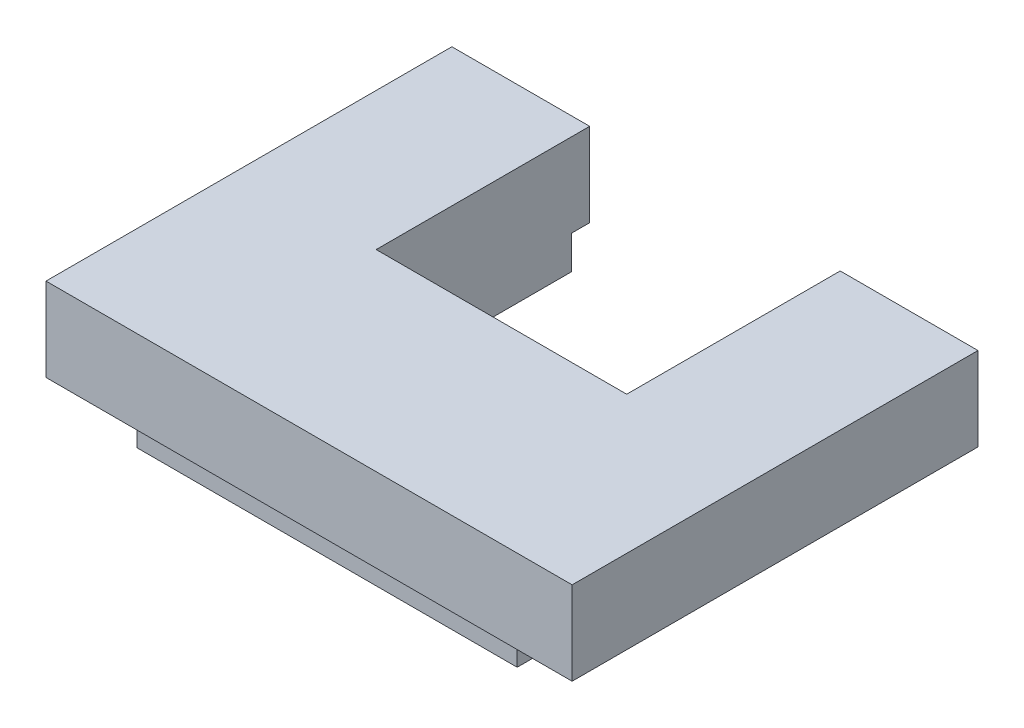
ISO-10303-21;
HEADER;
FILE_DESCRIPTION(('STEP AP214'),'2;1');
FILE_NAME('part.step','',(''),(''),'','','');
FILE_SCHEMA(('AUTOMOTIVE_DESIGN { 1 0 10303 214 1 1 1 1 }'));
ENDSEC;
DATA;
#1=APPLICATION_CONTEXT('core data for automotive mechanical design processes');
#2=APPLICATION_PROTOCOL_DEFINITION('international standard','automotive_design',2000,#1);
#3=PRODUCT_CONTEXT('',#1,'mechanical');
#4=PRODUCT('Part','Part','',(#3));
#5=PRODUCT_RELATED_PRODUCT_CATEGORY('part','',(#4));
#6=PRODUCT_DEFINITION_FORMATION('','',#4);
#7=PRODUCT_DEFINITION_CONTEXT('part definition',#1,'design');
#8=PRODUCT_DEFINITION('design','',#6,#7);
#9=PRODUCT_DEFINITION_SHAPE('','',#8);
#10=(LENGTH_UNIT() NAMED_UNIT(*) SI_UNIT(.MILLI.,.METRE.));
#11=(NAMED_UNIT(*) PLANE_ANGLE_UNIT() SI_UNIT($,.RADIAN.));
#12=(NAMED_UNIT(*) SI_UNIT($,.STERADIAN.) SOLID_ANGLE_UNIT());
#13=UNCERTAINTY_MEASURE_WITH_UNIT(LENGTH_MEASURE(1.E-05),#10,'distance_accuracy_value','');
#14=(GEOMETRIC_REPRESENTATION_CONTEXT(3) GLOBAL_UNCERTAINTY_ASSIGNED_CONTEXT((#13)) GLOBAL_UNIT_ASSIGNED_CONTEXT((#10,
#11,#12)) REPRESENTATION_CONTEXT('',''));
#15=CARTESIAN_POINT('',(0.,0.,0.));
#16=DIRECTION('',(0.,0.,1.));
#17=DIRECTION('',(1.,0.,0.));
#18=AXIS2_PLACEMENT_3D('',#15,#16,#17);
#19=CARTESIAN_POINT('',(-400.05,-304.8,-308.61));
#20=DIRECTION('',(0.,0.,-1.));
#21=DIRECTION('',(-1.,0.,0.));
#22=AXIS2_PLACEMENT_3D('',#19,#20,#21);
#23=PLANE('',#22);
#24=DIRECTION('',(0.,1.,0.));
#25=VECTOR('',#24,1.);
#26=CARTESIAN_POINT('',(-190.5,-177.8,-308.61));
#27=LINE('',#26,#25);
#28=CARTESIAN_POINT('',(-190.5,-127.,-308.61));
#29=VERTEX_POINT('',#28);
#30=CARTESIAN_POINT('',(-190.5,0.,-308.61));
#31=VERTEX_POINT('',#30);
#32=EDGE_CURVE('E244',#29,#31,#27,.T.);
#33=ORIENTED_EDGE('',*,*,#32,.F.);
#34=DIRECTION('',(-1.,0.,0.));
#35=VECTOR('',#34,1.);
#36=CARTESIAN_POINT('',(0.,-127.,-308.61));
#37=LINE('',#36,#35);
#38=CARTESIAN_POINT('',(-400.05,-127.,-308.61));
#39=VERTEX_POINT('',#38);
#40=EDGE_CURVE('E185',#29,#39,#37,.T.);
#41=ORIENTED_EDGE('',*,*,#40,.T.);
#42=DIRECTION('',(0.,1.,0.));
#43=VECTOR('',#42,1.);
#44=CARTESIAN_POINT('',(-400.05,-304.8,-308.61));
#45=LINE('',#44,#43);
#46=CARTESIAN_POINT('',(-400.05,0.,-308.61));
#47=VERTEX_POINT('',#46);
#48=EDGE_CURVE('E215',#39,#47,#45,.T.);
#49=ORIENTED_EDGE('',*,*,#48,.T.);
#50=DIRECTION('',(-1.,0.,0.));
#51=VECTOR('',#50,1.);
#52=CARTESIAN_POINT('',(-400.05,0.,-308.61));
#53=LINE('',#52,#51);
#54=EDGE_CURVE('E201',#31,#47,#53,.T.);
#55=ORIENTED_EDGE('',*,*,#54,.F.);
#56=EDGE_LOOP('',(#33,#41,#49,#55));
#57=FACE_BOUND('',#56,.T.);
#58=ADVANCED_FACE('F33',(#57),#23,.T.);
#59=CARTESIAN_POINT('',(0.,-127.,-281.180233168584));
#60=DIRECTION('',(0.,0.,1.));
#61=DIRECTION('',(1.,0.,0.));
#62=AXIS2_PLACEMENT_3D('',#59,#60,#61);
#63=PLANE('',#62);
#64=DIRECTION('',(-1.,0.,0.));
#65=VECTOR('',#64,1.);
#66=CARTESIAN_POINT('',(0.,-127.,-281.180233168584));
#67=LINE('',#66,#65);
#68=CARTESIAN_POINT('',(-190.5,-127.,-281.180233168584));
#69=VERTEX_POINT('',#68);
#70=CARTESIAN_POINT('',(-289.049614653322,-127.,-281.180233168584));
#71=VERTEX_POINT('',#70);
#72=EDGE_CURVE('E168',#69,#71,#67,.T.);
#73=ORIENTED_EDGE('',*,*,#72,.F.);
#74=DIRECTION('',(0.,-1.,0.));
#75=VECTOR('',#74,1.);
#76=CARTESIAN_POINT('',(-190.5,-127.,-281.180233168584));
#77=LINE('',#76,#75);
#78=CARTESIAN_POINT('',(-190.5,-177.8,-281.180233168584));
#79=VERTEX_POINT('',#78);
#80=EDGE_CURVE('E248',#69,#79,#77,.T.);
#81=ORIENTED_EDGE('',*,*,#80,.T.);
#82=DIRECTION('',(-1.,0.,0.));
#83=VECTOR('',#82,1.);
#84=CARTESIAN_POINT('',(0.,-177.8,-281.180233168584));
#85=LINE('',#84,#83);
#86=CARTESIAN_POINT('',(-289.049614653322,-177.8,-281.180233168584));
#87=VERTEX_POINT('',#86);
#88=EDGE_CURVE('E152',#79,#87,#85,.T.);
#89=ORIENTED_EDGE('',*,*,#88,.T.);
#90=DIRECTION('',(0.,-1.,0.));
#91=VECTOR('',#90,1.);
#92=CARTESIAN_POINT('',(-289.049614653322,-127.,-281.180233168584));
#93=LINE('',#92,#91);
#94=EDGE_CURVE('E177',#71,#87,#93,.T.);
#95=ORIENTED_EDGE('',*,*,#94,.F.);
#96=EDGE_LOOP('',(#73,#81,#89,#95));
#97=FACE_BOUND('',#96,.T.);
#98=ADVANCED_FACE('F250',(#97),#63,.F.);
#99=CARTESIAN_POINT('',(400.05,-304.8,308.61));
#100=DIRECTION('',(1.,0.,0.));
#101=DIRECTION('',(0.,0.,-1.));
#102=AXIS2_PLACEMENT_3D('',#99,#100,#101);
#103=PLANE('',#102);
#104=DIRECTION('',(0.,0.,-1.));
#105=VECTOR('',#104,1.);
#106=CARTESIAN_POINT('',(400.05,-127.,0.));
#107=LINE('',#106,#105);
#108=CARTESIAN_POINT('',(400.05,-127.,308.61));
#109=VERTEX_POINT('',#108);
#110=CARTESIAN_POINT('',(400.05,-127.,-308.61));
#111=VERTEX_POINT('',#110);
#112=EDGE_CURVE('E195',#109,#111,#107,.T.);
#113=ORIENTED_EDGE('',*,*,#112,.T.);
#114=DIRECTION('',(0.,1.,0.));
#115=VECTOR('',#114,1.);
#116=CARTESIAN_POINT('',(400.05,-304.8,-308.61));
#117=LINE('',#116,#115);
#118=CARTESIAN_POINT('',(400.05,0.,-308.61));
#119=VERTEX_POINT('',#118);
#120=EDGE_CURVE('E211',#111,#119,#117,.T.);
#121=ORIENTED_EDGE('',*,*,#120,.T.);
#122=DIRECTION('',(0.,0.,-1.));
#123=VECTOR('',#122,1.);
#124=CARTESIAN_POINT('',(400.05,0.,308.61));
#125=LINE('',#124,#123);
#126=CARTESIAN_POINT('',(400.05,0.,308.61));
#127=VERTEX_POINT('',#126);
#128=EDGE_CURVE('E198',#127,#119,#125,.T.);
#129=ORIENTED_EDGE('',*,*,#128,.F.);
#130=DIRECTION('',(0.,1.,0.));
#131=VECTOR('',#130,1.);
#132=CARTESIAN_POINT('',(400.05,-304.8,308.61));
#133=LINE('',#132,#131);
#134=EDGE_CURVE('E41',#109,#127,#133,.T.);
#135=ORIENTED_EDGE('',*,*,#134,.F.);
#136=EDGE_LOOP('',(#113,#121,#129,#135));
#137=FACE_BOUND('',#136,.T.);
#138=ADVANCED_FACE('F35',(#137),#103,.T.);
#139=CARTESIAN_POINT('',(-400.05,-304.8,308.61));
#140=DIRECTION('',(0.,0.,1.));
#141=DIRECTION('',(1.,0.,0.));
#142=AXIS2_PLACEMENT_3D('',#139,#140,#141);
#143=PLANE('',#142);
#144=DIRECTION('',(1.,0.,0.));
#145=VECTOR('',#144,1.);
#146=CARTESIAN_POINT('',(0.,-127.,308.61));
#147=LINE('',#146,#145);
#148=CARTESIAN_POINT('',(-400.05,-127.,308.61));
#149=VERTEX_POINT('',#148);
#150=EDGE_CURVE('E192',#149,#109,#147,.T.);
#151=ORIENTED_EDGE('',*,*,#150,.T.);
#152=ORIENTED_EDGE('',*,*,#134,.T.);
#153=DIRECTION('',(1.,0.,0.));
#154=VECTOR('',#153,1.);
#155=CARTESIAN_POINT('',(-400.05,0.,308.61));
#156=LINE('',#155,#154);
#157=CARTESIAN_POINT('',(-400.05,0.,308.61));
#158=VERTEX_POINT('',#157);
#159=EDGE_CURVE('E208',#158,#127,#156,.T.);
#160=ORIENTED_EDGE('',*,*,#159,.F.);
#161=DIRECTION('',(0.,1.,0.));
#162=VECTOR('',#161,1.);
#163=CARTESIAN_POINT('',(-400.05,-304.8,308.61));
#164=LINE('',#163,#162);
#165=EDGE_CURVE('E213',#149,#158,#164,.T.);
#166=ORIENTED_EDGE('',*,*,#165,.F.);
#167=EDGE_LOOP('',(#151,#152,#160,#166));
#168=FACE_BOUND('',#167,.T.);
#169=ADVANCED_FACE('F233',(#168),#143,.T.);
#170=CARTESIAN_POINT('',(-400.05,-304.8,308.61));
#171=DIRECTION('',(-1.,0.,0.));
#172=DIRECTION('',(0.,0.,1.));
#173=AXIS2_PLACEMENT_3D('',#170,#171,#172);
#174=PLANE('',#173);
#175=DIRECTION('',(0.,0.,1.));
#176=VECTOR('',#175,1.);
#177=CARTESIAN_POINT('',(-400.05,-127.,0.));
#178=LINE('',#177,#176);
#179=EDGE_CURVE('E189',#39,#149,#178,.T.);
#180=ORIENTED_EDGE('',*,*,#179,.T.);
#181=ORIENTED_EDGE('',*,*,#165,.T.);
#182=DIRECTION('',(0.,0.,1.));
#183=VECTOR('',#182,1.);
#184=CARTESIAN_POINT('',(-400.05,0.,308.61));
#185=LINE('',#184,#183);
#186=EDGE_CURVE('E205',#47,#158,#185,.T.);
#187=ORIENTED_EDGE('',*,*,#186,.F.);
#188=ORIENTED_EDGE('',*,*,#48,.F.);
#189=EDGE_LOOP('',(#180,#181,#187,#188));
#190=FACE_BOUND('',#189,.T.);
#191=ADVANCED_FACE('F240',(#190),#174,.T.);
#192=DIRECTION('',(0.,1.,0.));
#193=VECTOR('',#192,1.);
#194=CARTESIAN_POINT('',(190.5,-177.8,-308.61));
#195=LINE('',#194,#193);
#196=CARTESIAN_POINT('',(190.5,-127.,-308.61));
#197=VERTEX_POINT('',#196);
#198=CARTESIAN_POINT('',(190.5,0.,-308.61));
#199=VERTEX_POINT('',#198);
#200=EDGE_CURVE('E225',#197,#199,#195,.T.);
#201=ORIENTED_EDGE('',*,*,#200,.T.);
#202=EDGE_CURVE('E202',#119,#199,#53,.T.);
#203=ORIENTED_EDGE('',*,*,#202,.F.);
#204=ORIENTED_EDGE('',*,*,#120,.F.);
#205=EDGE_CURVE('E186',#111,#197,#37,.T.);
#206=ORIENTED_EDGE('',*,*,#205,.T.);
#207=EDGE_LOOP('',(#201,#203,#204,#206));
#208=FACE_BOUND('',#207,.T.);
#209=ADVANCED_FACE('F224',(#208),#23,.T.);
#210=CARTESIAN_POINT('',(0.,0.,0.));
#211=DIRECTION('',(0.,-1.,0.));
#212=DIRECTION('',(0.,0.,-1.));
#213=AXIS2_PLACEMENT_3D('',#210,#211,#212);
#214=PLANE('',#213);
#215=DIRECTION('',(1.,0.,0.));
#216=VECTOR('',#215,1.);
#217=CARTESIAN_POINT('',(190.5,0.,16.0561031448891));
#218=LINE('',#217,#216);
#219=CARTESIAN_POINT('',(-190.5,0.,16.0561031448891));
#220=VERTEX_POINT('',#219);
#221=CARTESIAN_POINT('',(190.5,0.,16.0561031448891));
#222=VERTEX_POINT('',#221);
#223=EDGE_CURVE('E278',#220,#222,#218,.T.);
#224=ORIENTED_EDGE('',*,*,#223,.F.);
#225=DIRECTION('',(0.,0.,1.));
#226=VECTOR('',#225,1.);
#227=CARTESIAN_POINT('',(-190.5,0.,16.0561031448891));
#228=LINE('',#227,#226);
#229=EDGE_CURVE('E139',#31,#220,#228,.T.);
#230=ORIENTED_EDGE('',*,*,#229,.F.);
#231=ORIENTED_EDGE('',*,*,#54,.T.);
#232=ORIENTED_EDGE('',*,*,#186,.T.);
#233=ORIENTED_EDGE('',*,*,#159,.T.);
#234=ORIENTED_EDGE('',*,*,#128,.T.);
#235=ORIENTED_EDGE('',*,*,#202,.T.);
#236=DIRECTION('',(0.,0.,-1.));
#237=VECTOR('',#236,1.);
#238=CARTESIAN_POINT('',(190.5,0.,16.0561031448891));
#239=LINE('',#238,#237);
#240=EDGE_CURVE('E148',#222,#199,#239,.T.);
#241=ORIENTED_EDGE('',*,*,#240,.F.);
#242=EDGE_LOOP('',(#224,#230,#231,#232,#233,#234,#235,#241));
#243=FACE_BOUND('',#242,.T.);
#244=ADVANCED_FACE('F228',(#243),#214,.F.);
#245=CARTESIAN_POINT('',(0.,-127.,0.));
#246=DIRECTION('',(0.,1.,0.));
#247=DIRECTION('',(0.,0.,1.));
#248=AXIS2_PLACEMENT_3D('',#245,#246,#247);
#249=PLANE('',#248);
#250=ORIENTED_EDGE('',*,*,#40,.F.);
#251=DIRECTION('',(0.,0.,1.));
#252=VECTOR('',#251,1.);
#253=CARTESIAN_POINT('',(-190.5,-127.,0.));
#254=LINE('',#253,#252);
#255=EDGE_CURVE('E246',#29,#69,#254,.T.);
#256=ORIENTED_EDGE('',*,*,#255,.T.);
#257=ORIENTED_EDGE('',*,*,#72,.T.);
#258=DIRECTION('',(0.,0.,1.));
#259=VECTOR('',#258,1.);
#260=CARTESIAN_POINT('',(-289.049614653322,-127.,0.));
#261=LINE('',#260,#259);
#262=CARTESIAN_POINT('',(-289.049614653322,-127.,281.180233168584));
#263=VERTEX_POINT('',#262);
#264=EDGE_CURVE('E172',#71,#263,#261,.T.);
#265=ORIENTED_EDGE('',*,*,#264,.T.);
#266=DIRECTION('',(1.,0.,0.));
#267=VECTOR('',#266,1.);
#268=CARTESIAN_POINT('',(0.,-127.,281.180233168584));
#269=LINE('',#268,#267);
#270=CARTESIAN_POINT('',(289.049614653322,-127.,281.180233168584));
#271=VERTEX_POINT('',#270);
#272=EDGE_CURVE('E160',#263,#271,#269,.T.);
#273=ORIENTED_EDGE('',*,*,#272,.T.);
#274=DIRECTION('',(0.,0.,-1.));
#275=VECTOR('',#274,1.);
#276=CARTESIAN_POINT('',(289.049614653322,-127.,0.));
#277=LINE('',#276,#275);
#278=CARTESIAN_POINT('',(289.049614653322,-127.,-281.180233168584));
#279=VERTEX_POINT('',#278);
#280=EDGE_CURVE('E166',#271,#279,#277,.T.);
#281=ORIENTED_EDGE('',*,*,#280,.T.);
#282=CARTESIAN_POINT('',(190.5,-127.,-281.180233168584));
#283=VERTEX_POINT('',#282);
#284=EDGE_CURVE('E169',#279,#283,#67,.T.);
#285=ORIENTED_EDGE('',*,*,#284,.T.);
#286=DIRECTION('',(0.,0.,-1.));
#287=VECTOR('',#286,1.);
#288=CARTESIAN_POINT('',(190.5,-127.,0.));
#289=LINE('',#288,#287);
#290=EDGE_CURVE('E270',#283,#197,#289,.T.);
#291=ORIENTED_EDGE('',*,*,#290,.T.);
#292=ORIENTED_EDGE('',*,*,#205,.F.);
#293=ORIENTED_EDGE('',*,*,#112,.F.);
#294=ORIENTED_EDGE('',*,*,#150,.F.);
#295=ORIENTED_EDGE('',*,*,#179,.F.);
#296=EDGE_LOOP('',(#250,#256,#257,#265,#273,#281,#285,#291,#292,#293,#294,#295));
#297=FACE_BOUND('',#296,.T.);
#298=ADVANCED_FACE('F237',(#297),#249,.F.);
#299=CARTESIAN_POINT('',(0.,-127.,281.180233168584));
#300=DIRECTION('',(0.,0.,-1.));
#301=DIRECTION('',(-1.,0.,0.));
#302=AXIS2_PLACEMENT_3D('',#299,#300,#301);
#303=PLANE('',#302);
#304=DIRECTION('',(0.,-1.,0.));
#305=VECTOR('',#304,1.);
#306=CARTESIAN_POINT('',(-289.049614653322,-127.,281.180233168584));
#307=LINE('',#306,#305);
#308=CARTESIAN_POINT('',(-289.049614653322,-177.8,281.180233168584));
#309=VERTEX_POINT('',#308);
#310=EDGE_CURVE('E174',#263,#309,#307,.T.);
#311=ORIENTED_EDGE('',*,*,#310,.T.);
#312=DIRECTION('',(-1.,0.,0.));
#313=VECTOR('',#312,1.);
#314=CARTESIAN_POINT('',(-289.049614653322,-177.8,281.180233168584));
#315=LINE('',#314,#313);
#316=CARTESIAN_POINT('',(289.049614653322,-177.8,281.180233168584));
#317=VERTEX_POINT('',#316);
#318=EDGE_CURVE('E56',#317,#309,#315,.T.);
#319=ORIENTED_EDGE('',*,*,#318,.F.);
#320=DIRECTION('',(0.,-1.,0.));
#321=VECTOR('',#320,1.);
#322=CARTESIAN_POINT('',(289.049614653322,-127.,281.180233168584));
#323=LINE('',#322,#321);
#324=EDGE_CURVE('E182',#271,#317,#323,.T.);
#325=ORIENTED_EDGE('',*,*,#324,.F.);
#326=ORIENTED_EDGE('',*,*,#272,.F.);
#327=EDGE_LOOP('',(#311,#319,#325,#326));
#328=FACE_BOUND('',#327,.T.);
#329=ADVANCED_FACE('F260',(#328),#303,.F.);
#330=CARTESIAN_POINT('',(289.049614653322,-127.,0.));
#331=DIRECTION('',(-1.,0.,0.));
#332=DIRECTION('',(0.,0.,1.));
#333=AXIS2_PLACEMENT_3D('',#330,#331,#332);
#334=PLANE('',#333);
#335=ORIENTED_EDGE('',*,*,#324,.T.);
#336=DIRECTION('',(0.,0.,1.));
#337=VECTOR('',#336,1.);
#338=CARTESIAN_POINT('',(289.049614653322,-177.8,-308.61));
#339=LINE('',#338,#337);
#340=CARTESIAN_POINT('',(289.049614653322,-177.8,-281.180233168584));
#341=VERTEX_POINT('',#340);
#342=EDGE_CURVE('E161',#341,#317,#339,.T.);
#343=ORIENTED_EDGE('',*,*,#342,.F.);
#344=DIRECTION('',(0.,-1.,0.));
#345=VECTOR('',#344,1.);
#346=CARTESIAN_POINT('',(289.049614653322,-127.,-281.180233168584));
#347=LINE('',#346,#345);
#348=EDGE_CURVE('E179',#279,#341,#347,.T.);
#349=ORIENTED_EDGE('',*,*,#348,.F.);
#350=ORIENTED_EDGE('',*,*,#280,.F.);
#351=EDGE_LOOP('',(#335,#343,#349,#350));
#352=FACE_BOUND('',#351,.T.);
#353=ADVANCED_FACE('F263',(#352),#334,.F.);
#354=CARTESIAN_POINT('',(190.5,-177.8,-281.180233168584));
#355=VERTEX_POINT('',#354);
#356=EDGE_CURVE('E157',#341,#355,#85,.T.);
#357=ORIENTED_EDGE('',*,*,#356,.T.);
#358=DIRECTION('',(0.,1.,0.));
#359=VECTOR('',#358,1.);
#360=CARTESIAN_POINT('',(190.5,-127.,-281.180233168584));
#361=LINE('',#360,#359);
#362=EDGE_CURVE('E268',#355,#283,#361,.T.);
#363=ORIENTED_EDGE('',*,*,#362,.T.);
#364=ORIENTED_EDGE('',*,*,#284,.F.);
#365=ORIENTED_EDGE('',*,*,#348,.T.);
#366=EDGE_LOOP('',(#357,#363,#364,#365));
#367=FACE_BOUND('',#366,.T.);
#368=ADVANCED_FACE('F267',(#367),#63,.F.);
#369=CARTESIAN_POINT('',(-289.049614653322,-127.,0.));
#370=DIRECTION('',(1.,0.,0.));
#371=DIRECTION('',(0.,0.,-1.));
#372=AXIS2_PLACEMENT_3D('',#369,#370,#371);
#373=PLANE('',#372);
#374=ORIENTED_EDGE('',*,*,#94,.T.);
#375=DIRECTION('',(0.,0.,1.));
#376=VECTOR('',#375,1.);
#377=CARTESIAN_POINT('',(-289.049614653322,-177.8,-308.61));
#378=LINE('',#377,#376);
#379=EDGE_CURVE('E153',#87,#309,#378,.T.);
#380=ORIENTED_EDGE('',*,*,#379,.T.);
#381=ORIENTED_EDGE('',*,*,#310,.F.);
#382=ORIENTED_EDGE('',*,*,#264,.F.);
#383=EDGE_LOOP('',(#374,#380,#381,#382));
#384=FACE_BOUND('',#383,.T.);
#385=ADVANCED_FACE('F254',(#384),#373,.F.);
#386=CARTESIAN_POINT('',(-289.049614653322,-177.8,-308.61));
#387=DIRECTION('',(0.,1.,0.));
#388=DIRECTION('',(0.,0.,1.));
#389=AXIS2_PLACEMENT_3D('',#386,#387,#388);
#390=PLANE('',#389);
#391=ORIENTED_EDGE('',*,*,#88,.F.);
#392=DIRECTION('',(0.,0.,1.));
#393=VECTOR('',#392,1.);
#394=CARTESIAN_POINT('',(-190.5,-177.8,-308.61));
#395=LINE('',#394,#393);
#396=CARTESIAN_POINT('',(-190.5,-177.8,16.0561031448891));
#397=VERTEX_POINT('',#396);
#398=EDGE_CURVE('E11',#79,#397,#395,.T.);
#399=ORIENTED_EDGE('',*,*,#398,.T.);
#400=DIRECTION('',(1.,0.,0.));
#401=VECTOR('',#400,1.);
#402=CARTESIAN_POINT('',(190.5,-177.8,16.0561031448891));
#403=LINE('',#402,#401);
#404=CARTESIAN_POINT('',(190.5,-177.8,16.0561031448892));
#405=VERTEX_POINT('',#404);
#406=EDGE_CURVE('E146',#397,#405,#403,.T.);
#407=ORIENTED_EDGE('',*,*,#406,.T.);
#408=DIRECTION('',(0.,0.,-1.));
#409=VECTOR('',#408,1.);
#410=CARTESIAN_POINT('',(190.5,-177.8,16.0561031448891));
#411=LINE('',#410,#409);
#412=EDGE_CURVE('E48',#405,#355,#411,.T.);
#413=ORIENTED_EDGE('',*,*,#412,.T.);
#414=ORIENTED_EDGE('',*,*,#356,.F.);
#415=ORIENTED_EDGE('',*,*,#342,.T.);
#416=ORIENTED_EDGE('',*,*,#318,.T.);
#417=ORIENTED_EDGE('',*,*,#379,.F.);
#418=EDGE_LOOP('',(#391,#399,#407,#413,#414,#415,#416,#417));
#419=FACE_BOUND('',#418,.T.);
#420=ADVANCED_FACE('F151',(#419),#390,.F.);
#421=CARTESIAN_POINT('',(-190.5,-177.8,16.0561031448891));
#422=DIRECTION('',(-1.,0.,0.));
#423=DIRECTION('',(0.,0.,1.));
#424=AXIS2_PLACEMENT_3D('',#421,#422,#423);
#425=PLANE('',#424);
#426=ORIENTED_EDGE('',*,*,#32,.T.);
#427=ORIENTED_EDGE('',*,*,#229,.T.);
#428=DIRECTION('',(0.,1.,0.));
#429=VECTOR('',#428,1.);
#430=CARTESIAN_POINT('',(-190.5,-177.8,16.0561031448891));
#431=LINE('',#430,#429);
#432=EDGE_CURVE('E134',#397,#220,#431,.T.);
#433=ORIENTED_EDGE('',*,*,#432,.F.);
#434=ORIENTED_EDGE('',*,*,#398,.F.);
#435=ORIENTED_EDGE('',*,*,#80,.F.);
#436=ORIENTED_EDGE('',*,*,#255,.F.);
#437=EDGE_LOOP('',(#426,#427,#433,#434,#435,#436));
#438=FACE_BOUND('',#437,.T.);
#439=ADVANCED_FACE('F136',(#438),#425,.F.);
#440=CARTESIAN_POINT('',(190.5,-177.8,16.0561031448891));
#441=DIRECTION('',(1.,0.,0.));
#442=DIRECTION('',(0.,0.,-1.));
#443=AXIS2_PLACEMENT_3D('',#440,#441,#442);
#444=PLANE('',#443);
#445=ORIENTED_EDGE('',*,*,#362,.F.);
#446=ORIENTED_EDGE('',*,*,#412,.F.);
#447=DIRECTION('',(0.,1.,0.));
#448=VECTOR('',#447,1.);
#449=CARTESIAN_POINT('',(190.5,-177.8,16.0561031448891));
#450=LINE('',#449,#448);
#451=EDGE_CURVE('E143',#405,#222,#450,.T.);
#452=ORIENTED_EDGE('',*,*,#451,.T.);
#453=ORIENTED_EDGE('',*,*,#240,.T.);
#454=ORIENTED_EDGE('',*,*,#200,.F.);
#455=ORIENTED_EDGE('',*,*,#290,.F.);
#456=EDGE_LOOP('',(#445,#446,#452,#453,#454,#455));
#457=FACE_BOUND('',#456,.T.);
#458=ADVANCED_FACE('F283',(#457),#444,.F.);
#459=CARTESIAN_POINT('',(190.5,-177.8,16.0561031448891));
#460=DIRECTION('',(0.,0.,1.));
#461=DIRECTION('',(1.,0.,0.));
#462=AXIS2_PLACEMENT_3D('',#459,#460,#461);
#463=PLANE('',#462);
#464=ORIENTED_EDGE('',*,*,#223,.T.);
#465=ORIENTED_EDGE('',*,*,#451,.F.);
#466=ORIENTED_EDGE('',*,*,#406,.F.);
#467=ORIENTED_EDGE('',*,*,#432,.T.);
#468=EDGE_LOOP('',(#464,#465,#466,#467));
#469=FACE_BOUND('',#468,.T.);
#470=ADVANCED_FACE('F147',(#469),#463,.F.);
#471=CLOSED_SHELL('',(#58,#98,#138,#169,#191,#209,#244,#298,#329,#353,#368,#385,#420,#439,#458,#470));
#472=MANIFOLD_SOLID_BREP('B2',#471);
#473=ADVANCED_BREP_SHAPE_REPRESENTATION('',(#18,#472),#14);
#474=SHAPE_DEFINITION_REPRESENTATION(#9,#473);
ENDSEC;
END-ISO-10303-21;
